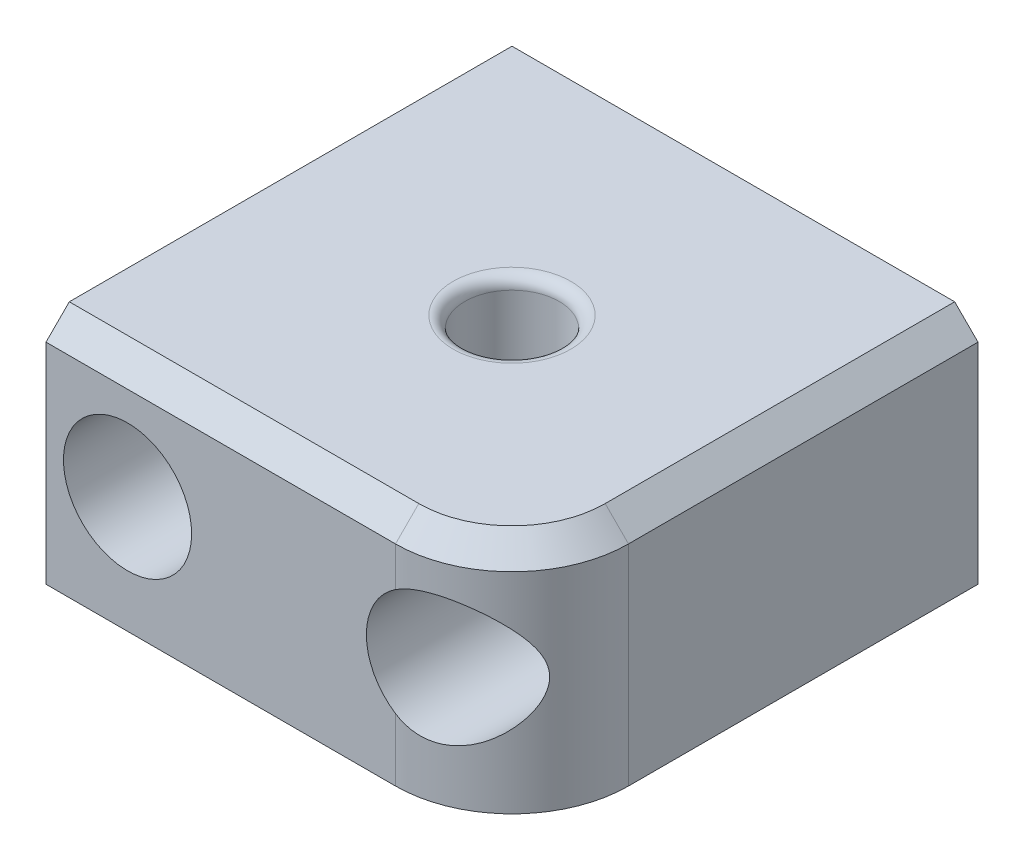
ISO-10303-21;
HEADER;
FILE_DESCRIPTION(('STEP AP214'),'2;1');
FILE_NAME('part.step','',(''),(''),'','','');
FILE_SCHEMA(('AUTOMOTIVE_DESIGN { 1 0 10303 214 1 1 1 1 }'));
ENDSEC;
DATA;
#1=APPLICATION_CONTEXT('core data for automotive mechanical design processes');
#2=APPLICATION_PROTOCOL_DEFINITION('international standard','automotive_design',2000,#1);
#3=PRODUCT_CONTEXT('',#1,'mechanical');
#4=PRODUCT('Part','Part','',(#3));
#5=PRODUCT_RELATED_PRODUCT_CATEGORY('part','',(#4));
#6=PRODUCT_DEFINITION_FORMATION('','',#4);
#7=PRODUCT_DEFINITION_CONTEXT('part definition',#1,'design');
#8=PRODUCT_DEFINITION('design','',#6,#7);
#9=PRODUCT_DEFINITION_SHAPE('','',#8);
#10=(LENGTH_UNIT() NAMED_UNIT(*) SI_UNIT(.MILLI.,.METRE.));
#11=(NAMED_UNIT(*) PLANE_ANGLE_UNIT() SI_UNIT($,.RADIAN.));
#12=(NAMED_UNIT(*) SI_UNIT($,.STERADIAN.) SOLID_ANGLE_UNIT());
#13=UNCERTAINTY_MEASURE_WITH_UNIT(LENGTH_MEASURE(1.E-05),#10,'distance_accuracy_value','');
#14=(GEOMETRIC_REPRESENTATION_CONTEXT(3) GLOBAL_UNCERTAINTY_ASSIGNED_CONTEXT((#13)) GLOBAL_UNIT_ASSIGNED_CONTEXT((#10,
#11,#12)) REPRESENTATION_CONTEXT('',''));
#15=CARTESIAN_POINT('',(0.,0.,0.));
#16=DIRECTION('',(0.,0.,1.));
#17=DIRECTION('',(1.,0.,0.));
#18=AXIS2_PLACEMENT_3D('',#15,#16,#17);
#19=CARTESIAN_POINT('',(10.,20.,20.));
#20=DIRECTION('',(0.,0.,-1.));
#21=DIRECTION('',(-1.,0.,0.));
#22=AXIS2_PLACEMENT_3D('',#19,#20,#21);
#23=PLANE('',#22);
#24=CARTESIAN_POINT('',(-13.,10.,20.));
#25=DIRECTION('',(0.,0.,1.));
#26=DIRECTION('',(1.,0.,0.));
#27=AXIS2_PLACEMENT_3D('',#24,#25,#26);
#28=CIRCLE('',#27,5.5);
#29=CARTESIAN_POINT('',(-7.5,10.,20.));
#30=VERTEX_POINT('',#29);
#31=EDGE_CURVE('E122',#30,#30,#28,.T.);
#32=ORIENTED_EDGE('',*,*,#31,.F.);
#33=EDGE_LOOP('',(#32));
#34=FACE_BOUND('',#33,.T.);
#35=DIRECTION('',(0.,-1.,0.));
#36=VECTOR('',#35,1.);
#37=CARTESIAN_POINT('',(10.,20.,20.));
#38=LINE('',#37,#36);
#39=CARTESIAN_POINT('',(10.,18.,20.));
#40=VERTEX_POINT('',#39);
#41=CARTESIAN_POINT('',(10.,14.6097722286465,20.));
#42=VERTEX_POINT('',#41);
#43=EDGE_CURVE('E102',#40,#42,#38,.T.);
#44=ORIENTED_EDGE('',*,*,#43,.F.);
#45=DIRECTION('',(-1.,0.,0.));
#46=VECTOR('',#45,1.);
#47=CARTESIAN_POINT('',(-20.,18.,20.));
#48=LINE('',#47,#46);
#49=CARTESIAN_POINT('',(-20.,18.,20.));
#50=VERTEX_POINT('',#49);
#51=EDGE_CURVE('E57',#40,#50,#48,.T.);
#52=ORIENTED_EDGE('',*,*,#51,.T.);
#53=DIRECTION('',(0.,-1.,0.));
#54=VECTOR('',#53,1.);
#55=CARTESIAN_POINT('',(-20.,20.,20.));
#56=LINE('',#55,#54);
#57=CARTESIAN_POINT('',(-20.,0.,20.));
#58=VERTEX_POINT('',#57);
#59=EDGE_CURVE('E111',#50,#58,#56,.T.);
#60=ORIENTED_EDGE('',*,*,#59,.T.);
#61=DIRECTION('',(1.,0.,0.));
#62=VECTOR('',#61,1.);
#63=CARTESIAN_POINT('',(10.,0.,20.));
#64=LINE('',#63,#62);
#65=CARTESIAN_POINT('',(10.,0.,20.));
#66=VERTEX_POINT('',#65);
#67=EDGE_CURVE('E381',#58,#66,#64,.T.);
#68=ORIENTED_EDGE('',*,*,#67,.T.);
#69=CARTESIAN_POINT('',(10.,5.39022777135355,20.));
#70=VERTEX_POINT('',#69);
#71=EDGE_CURVE('E115',#70,#66,#38,.T.);
#72=ORIENTED_EDGE('',*,*,#71,.F.);
#73=CARTESIAN_POINT('',(13.,10.,20.));
#74=DIRECTION('',(0.,0.,1.));
#75=DIRECTION('',(1.,0.,0.));
#76=AXIS2_PLACEMENT_3D('',#73,#74,#75);
#77=CIRCLE('',#76,5.5);
#78=EDGE_CURVE('E116',#42,#70,#77,.T.);
#79=ORIENTED_EDGE('',*,*,#78,.F.);
#80=EDGE_LOOP('',(#44,#52,#60,#68,#72,#79));
#81=FACE_BOUND('',#80,.T.);
#82=ADVANCED_FACE('F41',(#34,#81),#23,.F.);
#83=CARTESIAN_POINT('',(13.,10.,-20.));
#84=DIRECTION('',(0.,0.,1.));
#85=DIRECTION('',(1.,0.,0.));
#86=AXIS2_PLACEMENT_3D('',#83,#84,#85);
#87=CYLINDRICAL_SURFACE('',#86,2.65);
#88=CARTESIAN_POINT('',(13.,10.,-20.));
#89=DIRECTION('',(0.,0.,-1.));
#90=DIRECTION('',(-1.,0.,0.));
#91=AXIS2_PLACEMENT_3D('',#88,#89,#90);
#92=CIRCLE('',#91,2.65);
#93=CARTESIAN_POINT('',(10.35,10.,-20.));
#94=VERTEX_POINT('',#93);
#95=EDGE_CURVE('E120',#94,#94,#92,.T.);
#96=ORIENTED_EDGE('',*,*,#95,.T.);
#97=EDGE_LOOP('',(#96));
#98=FACE_BOUND('',#97,.T.);
#99=CARTESIAN_POINT('',(13.,10.,-9.00000000000001));
#100=DIRECTION('',(0.,0.,1.));
#101=DIRECTION('',(1.,0.,0.));
#102=AXIS2_PLACEMENT_3D('',#99,#100,#101);
#103=CIRCLE('',#102,2.65);
#104=CARTESIAN_POINT('',(15.65,10.,-9.00000000000001));
#105=VERTEX_POINT('',#104);
#106=EDGE_CURVE('E117',#105,#105,#103,.T.);
#107=ORIENTED_EDGE('',*,*,#106,.T.);
#108=EDGE_LOOP('',(#107));
#109=FACE_BOUND('',#108,.T.);
#110=ADVANCED_FACE('F157',(#98,#109),#87,.F.);
#111=CARTESIAN_POINT('',(-13.,10.,-20.));
#112=DIRECTION('',(0.,0.,1.));
#113=DIRECTION('',(1.,0.,0.));
#114=AXIS2_PLACEMENT_3D('',#111,#112,#113);
#115=CYLINDRICAL_SURFACE('',#114,2.65);
#116=CARTESIAN_POINT('',(-13.,10.,-20.));
#117=DIRECTION('',(0.,0.,1.));
#118=DIRECTION('',(1.,0.,0.));
#119=AXIS2_PLACEMENT_3D('',#116,#117,#118);
#120=CIRCLE('',#119,2.65);
#121=CARTESIAN_POINT('',(-10.35,10.,-20.));
#122=VERTEX_POINT('',#121);
#123=EDGE_CURVE('E137',#122,#122,#120,.T.);
#124=ORIENTED_EDGE('',*,*,#123,.F.);
#125=EDGE_LOOP('',(#124));
#126=FACE_BOUND('',#125,.T.);
#127=CARTESIAN_POINT('',(-13.,10.,-9.00000000000001));
#128=DIRECTION('',(0.,0.,1.));
#129=DIRECTION('',(1.,0.,0.));
#130=AXIS2_PLACEMENT_3D('',#127,#128,#129);
#131=CIRCLE('',#130,2.65);
#132=CARTESIAN_POINT('',(-10.35,10.,-9.00000000000001));
#133=VERTEX_POINT('',#132);
#134=EDGE_CURVE('E261',#133,#133,#131,.F.);
#135=ORIENTED_EDGE('',*,*,#134,.F.);
#136=EDGE_LOOP('',(#135));
#137=FACE_BOUND('',#136,.T.);
#138=ADVANCED_FACE('F155',(#126,#137),#115,.F.);
#139=CARTESIAN_POINT('',(10.,20.,10.));
#140=DIRECTION('',(0.,-1.,0.));
#141=DIRECTION('',(0.,0.,-1.));
#142=AXIS2_PLACEMENT_3D('',#139,#140,#141);
#143=CYLINDRICAL_SURFACE('',#142,10.);
#144=DIRECTION('',(0.,-1.,0.));
#145=VECTOR('',#144,1.);
#146=CARTESIAN_POINT('',(20.,20.,10.));
#147=LINE('',#146,#145);
#148=CARTESIAN_POINT('',(20.,18.,10.));
#149=VERTEX_POINT('',#148);
#150=CARTESIAN_POINT('',(20.,0.,10.));
#151=VERTEX_POINT('',#150);
#152=EDGE_CURVE('E248',#149,#151,#147,.T.);
#153=ORIENTED_EDGE('',*,*,#152,.F.);
#154=CARTESIAN_POINT('',(10.,18.,10.));
#155=DIRECTION('',(0.,1.,0.));
#156=DIRECTION('',(0.,0.,1.));
#157=AXIS2_PLACEMENT_3D('',#154,#155,#156);
#158=CIRCLE('',#157,10.);
#159=EDGE_CURVE('E63',#149,#40,#158,.F.);
#160=ORIENTED_EDGE('',*,*,#159,.T.);
#161=ORIENTED_EDGE('',*,*,#43,.T.);
#162=CARTESIAN_POINT('',(10.,14.6097722286465,20.));
#163=CARTESIAN_POINT('',(10.1173388692386,14.6861607876696,20.0000158263754));
#164=CARTESIAN_POINT('',(10.2376294395082,14.758041465536,19.9979354379046));
#165=CARTESIAN_POINT('',(10.4832188074938,14.8923759736413,19.9890697856227));
#166=CARTESIAN_POINT('',(10.6085183600978,14.9548283761489,19.9822838101093));
#167=CARTESIAN_POINT('',(10.8629399010457,15.0697568889503,19.9635130046729));
#168=CARTESIAN_POINT('',(10.9920537471823,15.12225269333,19.9515385949342));
#169=CARTESIAN_POINT('',(11.2533138802797,15.2171252254948,19.9220198237589));
#170=CARTESIAN_POINT('',(11.3854598730991,15.2595029303022,19.9044760004965));
#171=CARTESIAN_POINT('',(11.6519200979873,15.3340272936006,19.8635366195592));
#172=CARTESIAN_POINT('',(11.7862371080745,15.3661595369929,19.8401328990352));
#173=CARTESIAN_POINT('',(12.0558214821592,15.4200950898568,19.7873627586316));
#174=CARTESIAN_POINT('',(12.1910891814806,15.4418945478979,19.7579941212132));
#175=CARTESIAN_POINT('',(12.4613663313027,15.4752536082437,19.6933466477788));
#176=CARTESIAN_POINT('',(12.5963758970356,15.4868204797413,19.6580720285713));
#177=CARTESIAN_POINT('',(12.8652866093096,15.4999985662062,19.5817367717533));
#178=CARTESIAN_POINT('',(12.9991873112607,15.5016059643148,19.5406739220322));
#179=CARTESIAN_POINT('',(13.2651050819672,15.4952185569551,19.452973458731));
#180=CARTESIAN_POINT('',(13.3971195111951,15.4872114188044,19.4063287543955));
#181=CARTESIAN_POINT('',(13.6583289179098,15.46203643792,19.3078543025935));
#182=CARTESIAN_POINT('',(13.7875228738198,15.4448653314676,19.256022713181));
#183=CARTESIAN_POINT('',(14.169888617195,15.3803441800482,19.0933257343682));
#184=CARTESIAN_POINT('',(14.4179132625106,15.3199841698074,18.9752352319712));
#185=CARTESIAN_POINT('',(14.9252484408264,15.1597220981765,18.7082729198162));
#186=CARTESIAN_POINT('',(15.1822298738246,15.0558870730931,18.557402885908));
#187=CARTESIAN_POINT('',(15.6710840861988,14.8155537367402,18.2415725618588));
#188=CARTESIAN_POINT('',(15.9029429915791,14.6790375093799,18.0766045751189));
#189=CARTESIAN_POINT('',(16.2534603968918,14.4374181596721,17.8052642955046));
#190=CARTESIAN_POINT('',(16.380571008897,14.3413008640576,17.7015741573647));
#191=CARTESIAN_POINT('',(16.6250834004998,14.1393126927105,17.4922717479223));
#192=CARTESIAN_POINT('',(16.7424865665872,14.0334432144396,17.3866597537515));
#193=CARTESIAN_POINT('',(16.9676082309509,13.8122204451634,17.1747035302275));
#194=CARTESIAN_POINT('',(17.0753160254007,13.6968569350908,17.0683586278089));
#195=CARTESIAN_POINT('',(17.2807712486375,13.4568697490415,16.8565384344219));
#196=CARTESIAN_POINT('',(17.3785206990659,13.3322479615047,16.7510629709608));
#197=CARTESIAN_POINT('',(17.5461808054492,13.0981970876933,16.5626136636907));
#198=CARTESIAN_POINT('',(17.6178481631539,12.9903937251048,16.4791795561284));
#199=CARTESIAN_POINT('',(17.7542928543877,12.7683364082798,16.3152442502903));
#200=CARTESIAN_POINT('',(17.8190694159156,12.6540817334695,16.2347433812988));
#201=CARTESIAN_POINT('',(17.9412658665028,12.4189701308323,16.0783322634051));
#202=CARTESIAN_POINT('',(17.9986972602661,12.2981239615356,16.0024149362953));
#203=CARTESIAN_POINT('',(18.1057355521932,12.0493393849904,15.8570641331475));
#204=CARTESIAN_POINT('',(18.1553463807849,11.9214045842926,15.7876274073198));
#205=CARTESIAN_POINT('',(18.2587045302167,11.6210626287362,15.6395073082079));
#206=CARTESIAN_POINT('',(18.3097135011064,11.446241443709,15.5636875863487));
#207=CARTESIAN_POINT('',(18.3951234486174,11.0848584294389,15.4339677159678));
#208=CARTESIAN_POINT('',(18.4295594624046,10.8983223198448,15.3800213629877));
#209=CARTESIAN_POINT('',(18.4754104216249,10.5447489842485,15.307449184269));
#210=CARTESIAN_POINT('',(18.4894787886144,10.3789134533801,15.2847766715132));
#211=CARTESIAN_POINT('',(18.5023444652193,10.045140341422,15.2640594001967));
#212=CARTESIAN_POINT('',(18.5011513073911,9.87720413793042,15.2659992684014));
#213=CARTESIAN_POINT('',(18.4836459191987,9.54466970912424,15.29414577743));
#214=CARTESIAN_POINT('',(18.4673687615747,9.3800646452801,15.3202961248387));
#215=CARTESIAN_POINT('',(18.4211022628984,9.05750168172021,15.393225537063));
#216=CARTESIAN_POINT('',(18.3910948396507,8.8995528484958,15.4400318019761));
#217=CARTESIAN_POINT('',(18.2979898239858,8.50196966721451,15.581573275045));
#218=CARTESIAN_POINT('',(18.2258069014167,8.26875998559546,15.6883181746135));
#219=CARTESIAN_POINT('',(18.0992521773763,7.9355763260172,15.8657924414168));
#220=CARTESIAN_POINT('',(18.0539048876099,7.82707471166532,15.9279937452781));
#221=CARTESIAN_POINT('',(17.9575026808773,7.61532520585413,16.0567810834184));
#222=CARTESIAN_POINT('',(17.9064491765756,7.51207602324151,16.1233660307863));
#223=CARTESIAN_POINT('',(17.7672529242272,7.25112508860536,16.2999051427084));
#224=CARTESIAN_POINT('',(17.6750014809067,7.09724386105892,16.412265529435));
#225=CARTESIAN_POINT('',(17.4777040197303,6.8012823795196,16.6412978197819));
#226=CARTESIAN_POINT('',(17.3726511507165,6.65920851369153,16.7579720086205));
#227=CARTESIAN_POINT('',(17.150083310473,6.38644052350263,16.9930346380498));
#228=CARTESIAN_POINT('',(17.0325579351948,6.25575606783647,17.1114244375234));
#229=CARTESIAN_POINT('',(16.7853422935502,6.00599891033365,17.3476776531527));
#230=CARTESIAN_POINT('',(16.6556544072294,5.88692394593357,17.4655411675861));
#231=CARTESIAN_POINT('',(16.3810027457244,5.65816781602905,17.7017126442083));
#232=CARTESIAN_POINT('',(16.2357505287406,5.54877492961582,17.8199653595798));
#233=CARTESIAN_POINT('',(15.9327425781965,5.34355287667126,18.0522674861234));
#234=CARTESIAN_POINT('',(15.7749848644439,5.247725864958,18.1663162274085));
#235=CARTESIAN_POINT('',(15.4476861289906,5.07117358478961,18.3881893812908));
#236=CARTESIAN_POINT('',(15.2781715986556,4.99041578633516,18.4960268457261));
#237=CARTESIAN_POINT('',(14.9277375788884,4.84541538268462,18.7039562329069));
#238=CARTESIAN_POINT('',(14.7468235208477,4.78116498540428,18.8040517944537));
#239=CARTESIAN_POINT('',(14.4296043627291,4.68728371737229,18.9666248380371));
#240=CARTESIAN_POINT('',(14.295874635604,4.65303100034863,19.0314919524443));
#241=CARTESIAN_POINT('',(14.0238776391738,4.59435306727914,19.1559136375513));
#242=CARTESIAN_POINT('',(13.8856115147384,4.56992539196902,19.2154695347708));
#243=CARTESIAN_POINT('',(13.6053620431143,4.53158857270311,19.3286755026767));
#244=CARTESIAN_POINT('',(13.4633814726475,4.51767179141337,19.3823298372385));
#245=CARTESIAN_POINT('',(13.176520711705,4.50095647302362,19.4832923094626));
#246=CARTESIAN_POINT('',(13.0316404721737,4.49815812418202,19.5306003396556));
#247=CARTESIAN_POINT('',(12.7392597328832,4.50422786590803,19.6187263197768));
#248=CARTESIAN_POINT('',(12.5917490933791,4.51316149057105,19.659506373092));
#249=CARTESIAN_POINT('',(12.2961691208234,4.54319770291698,19.7340042820599));
#250=CARTESIAN_POINT('',(12.1480997591842,4.56430092189311,19.7677217712211));
#251=CARTESIAN_POINT('',(11.8527553083062,4.61888718474812,19.8280216116376));
#252=CARTESIAN_POINT('',(11.7054803440871,4.65237212268595,19.8546028701736));
#253=CARTESIAN_POINT('',(11.4132421880147,4.7316851428249,19.9007399452591));
#254=CARTESIAN_POINT('',(11.2682784033673,4.77751000420343,19.9202975919255));
#255=CARTESIAN_POINT('',(10.9283526112748,4.90078555373354,19.9587784679679));
#256=CARTESIAN_POINT('',(10.7349693221037,4.98365445290103,19.9747284927647));
#257=CARTESIAN_POINT('',(10.4528875930995,5.12421451230605,19.9901852628815));
#258=CARTESIAN_POINT('',(10.3602321929138,5.17375154184167,19.9939263587969));
#259=CARTESIAN_POINT('',(10.1778443235659,5.27808675774958,19.9988341724793));
#260=CARTESIAN_POINT('',(10.0881122498723,5.33288565202323,20.0000005433496));
#261=CARTESIAN_POINT('',(10.,5.39022777135355,20.));
#262=B_SPLINE_CURVE_WITH_KNOTS('',3,(#162,#163,#164,#165,#166,#167,#168,#169,#170,#171,#172,
#173,#174,#175,#176,#177,#178,#179,#180,#181,#182,#183,#184,#185,#186,#187,#188,#189,#190,#191,
#192,#193,#194,#195,#196,#197,#198,#199,#200,#201,#202,#203,#204,#205,#206,#207,#208,#209,#210,
#211,#212,#213,#214,#215,#216,#217,#218,#219,#220,#221,#222,#223,#224,#225,#226,#227,#228,#229,
#230,#231,#232,#233,#234,#235,#236,#237,#238,#239,#240,#241,#242,#243,#244,#245,#246,#247,#248,
#249,#250,#251,#252,#253,#254,#255,#256,#257,#258,#259,#260,#261),.UNSPECIFIED.,.F.,.F.,(4,2,2,
2,2,2,2,2,2,2,2,2,2,2,2,2,2,2,2,2,2,2,2,2,2,2,2,2,2,2,2,2,2,2,2,2,2,2,2,2,2,2,2,2,2,2,2,2,2,4),
(0.,0.419942565737726,0.839948660063895,1.25911511740366,1.67824108287348,2.0979541718961,
2.51782358150687,2.93739447730783,3.3571261591041,3.77739681146972,4.19781724190184,
5.03844222722302,5.98186862617326,6.9258134080197,7.4957409457197,8.06558694099801,
8.63605452998839,9.20640607672379,9.66815199407667,10.1299495881568,10.5910147738264,
11.0518474953463,11.6418512526907,12.2306021333771,12.7321908071276,13.233466197066,
13.7335789572169,14.2343522494472,15.0288369371579,15.4277740894608,15.8266126963587,
16.4608045496602,17.0953373173474,17.7304036094526,18.3653458856093,19.0152840234837,
19.665325282671,20.3139466360101,20.9622612519876,21.4194173256134,21.8764588991333,
22.3331680607584,22.7898849553966,23.2491639264142,23.7084667245023,24.1678398122418,
24.6270931158079,25.2581157938651,25.5733453839875,25.8886174428845),.UNSPECIFIED.);
#263=EDGE_CURVE('E108',#42,#70,#262,.T.);
#264=ORIENTED_EDGE('',*,*,#263,.T.);
#265=ORIENTED_EDGE('',*,*,#71,.T.);
#266=CARTESIAN_POINT('',(10.,0.,10.));
#267=DIRECTION('',(0.,1.,0.));
#268=DIRECTION('',(0.,0.,1.));
#269=AXIS2_PLACEMENT_3D('',#266,#267,#268);
#270=CIRCLE('',#269,10.);
#271=EDGE_CURVE('E254',#66,#151,#270,.T.);
#272=ORIENTED_EDGE('',*,*,#271,.T.);
#273=EDGE_LOOP('',(#153,#160,#161,#264,#265,#272));
#274=FACE_BOUND('',#273,.T.);
#275=ADVANCED_FACE('F110',(#274),#143,.T.);
#276=CARTESIAN_POINT('',(20.,20.,-20.));
#277=DIRECTION('',(0.,0.,1.));
#278=DIRECTION('',(1.,0.,0.));
#279=AXIS2_PLACEMENT_3D('',#276,#277,#278);
#280=PLANE('',#279);
#281=DIRECTION('',(-1.,0.,0.));
#282=VECTOR('',#281,1.);
#283=CARTESIAN_POINT('',(20.,20.,-20.));
#284=LINE('',#283,#282);
#285=CARTESIAN_POINT('',(18.,20.,-20.));
#286=VERTEX_POINT('',#285);
#287=CARTESIAN_POINT('',(-20.,20.,-20.));
#288=VERTEX_POINT('',#287);
#289=EDGE_CURVE('E387',#286,#288,#284,.T.);
#290=ORIENTED_EDGE('',*,*,#289,.F.);
#291=DIRECTION('',(0.707106781186546,-0.707106781186549,0.));
#292=VECTOR('',#291,1.);
#293=CARTESIAN_POINT('',(18.,20.,-20.));
#294=LINE('',#293,#292);
#295=CARTESIAN_POINT('',(20.,18.,-20.));
#296=VERTEX_POINT('',#295);
#297=EDGE_CURVE('E239',#286,#296,#294,.T.);
#298=ORIENTED_EDGE('',*,*,#297,.T.);
#299=DIRECTION('',(0.,-1.,0.));
#300=VECTOR('',#299,1.);
#301=CARTESIAN_POINT('',(20.,20.,-20.));
#302=LINE('',#301,#300);
#303=CARTESIAN_POINT('',(20.,0.,-20.));
#304=VERTEX_POINT('',#303);
#305=EDGE_CURVE('E252',#296,#304,#302,.T.);
#306=ORIENTED_EDGE('',*,*,#305,.T.);
#307=DIRECTION('',(-1.,0.,0.));
#308=VECTOR('',#307,1.);
#309=CARTESIAN_POINT('',(20.,0.,-20.));
#310=LINE('',#309,#308);
#311=CARTESIAN_POINT('',(-20.,0.,-20.));
#312=VERTEX_POINT('',#311);
#313=EDGE_CURVE('E391',#304,#312,#310,.T.);
#314=ORIENTED_EDGE('',*,*,#313,.T.);
#315=DIRECTION('',(0.,-1.,0.));
#316=VECTOR('',#315,1.);
#317=CARTESIAN_POINT('',(-20.,20.,-20.));
#318=LINE('',#317,#316);
#319=EDGE_CURVE('E259',#288,#312,#318,.T.);
#320=ORIENTED_EDGE('',*,*,#319,.F.);
#321=EDGE_LOOP('',(#290,#298,#306,#314,#320));
#322=FACE_BOUND('',#321,.T.);
#323=ORIENTED_EDGE('',*,*,#95,.F.);
#324=EDGE_LOOP('',(#323));
#325=FACE_BOUND('',#324,.T.);
#326=ORIENTED_EDGE('',*,*,#123,.T.);
#327=EDGE_LOOP('',(#326));
#328=FACE_BOUND('',#327,.T.);
#329=ADVANCED_FACE('F173',(#322,#325,#328),#280,.F.);
#330=CARTESIAN_POINT('',(10.,20.,10.));
#331=DIRECTION('',(0.,1.,0.));
#332=DIRECTION('',(0.,0.,1.));
#333=AXIS2_PLACEMENT_3D('',#330,#331,#332);
#334=PLANE('',#333);
#335=CARTESIAN_POINT('',(0.,20.,0.));
#336=DIRECTION('',(0.,1.,0.));
#337=DIRECTION('',(0.,0.,1.));
#338=AXIS2_PLACEMENT_3D('',#335,#336,#337);
#339=CIRCLE('',#338,5.05);
#340=CARTESIAN_POINT('',(0.,20.,5.05));
#341=VERTEX_POINT('',#340);
#342=EDGE_CURVE('E11',#341,#341,#339,.F.);
#343=ORIENTED_EDGE('',*,*,#342,.T.);
#344=EDGE_LOOP('',(#343));
#345=FACE_BOUND('',#344,.T.);
#346=CARTESIAN_POINT('',(10.,20.,10.));
#347=DIRECTION('',(0.,1.,0.));
#348=DIRECTION('',(0.,0.,1.));
#349=AXIS2_PLACEMENT_3D('',#346,#347,#348);
#350=CIRCLE('',#349,8.00000000000001);
#351=CARTESIAN_POINT('',(10.,20.,18.));
#352=VERTEX_POINT('',#351);
#353=CARTESIAN_POINT('',(18.,20.,10.));
#354=VERTEX_POINT('',#353);
#355=EDGE_CURVE('E234',#352,#354,#350,.T.);
#356=ORIENTED_EDGE('',*,*,#355,.T.);
#357=DIRECTION('',(0.,0.,-1.));
#358=VECTOR('',#357,1.);
#359=CARTESIAN_POINT('',(18.,20.,-20.));
#360=LINE('',#359,#358);
#361=EDGE_CURVE('E238',#354,#286,#360,.T.);
#362=ORIENTED_EDGE('',*,*,#361,.T.);
#363=ORIENTED_EDGE('',*,*,#289,.T.);
#364=DIRECTION('',(0.,0.,1.));
#365=VECTOR('',#364,1.);
#366=CARTESIAN_POINT('',(-20.,20.,20.));
#367=LINE('',#366,#365);
#368=CARTESIAN_POINT('',(-20.,20.,18.));
#369=VERTEX_POINT('',#368);
#370=EDGE_CURVE('E390',#288,#369,#367,.T.);
#371=ORIENTED_EDGE('',*,*,#370,.T.);
#372=DIRECTION('',(1.,0.,0.));
#373=VECTOR('',#372,1.);
#374=CARTESIAN_POINT('',(10.,20.,18.));
#375=LINE('',#374,#373);
#376=EDGE_CURVE('E223',#369,#352,#375,.T.);
#377=ORIENTED_EDGE('',*,*,#376,.T.);
#378=EDGE_LOOP('',(#356,#362,#363,#371,#377));
#379=FACE_BOUND('',#378,.T.);
#380=ADVANCED_FACE('F169',(#345,#379),#334,.T.);
#381=CARTESIAN_POINT('',(10.,0.,10.));
#382=DIRECTION('',(0.,1.,0.));
#383=DIRECTION('',(0.,0.,1.));
#384=AXIS2_PLACEMENT_3D('',#381,#382,#383);
#385=PLANE('',#384);
#386=DIRECTION('',(0.,0.,1.));
#387=VECTOR('',#386,1.);
#388=CARTESIAN_POINT('',(-20.,0.,20.));
#389=LINE('',#388,#387);
#390=EDGE_CURVE('E382',#312,#58,#389,.T.);
#391=ORIENTED_EDGE('',*,*,#390,.F.);
#392=ORIENTED_EDGE('',*,*,#313,.F.);
#393=DIRECTION('',(0.,0.,-1.));
#394=VECTOR('',#393,1.);
#395=CARTESIAN_POINT('',(20.,0.,10.));
#396=LINE('',#395,#394);
#397=EDGE_CURVE('E395',#151,#304,#396,.T.);
#398=ORIENTED_EDGE('',*,*,#397,.F.);
#399=ORIENTED_EDGE('',*,*,#271,.F.);
#400=ORIENTED_EDGE('',*,*,#67,.F.);
#401=EDGE_LOOP('',(#391,#392,#398,#399,#400));
#402=FACE_BOUND('',#401,.T.);
#403=CARTESIAN_POINT('',(0.,0.,0.));
#404=DIRECTION('',(0.,1.,0.));
#405=DIRECTION('',(0.,0.,1.));
#406=AXIS2_PLACEMENT_3D('',#403,#404,#405);
#407=CIRCLE('',#406,4.05);
#408=CARTESIAN_POINT('',(0.,0.,4.05));
#409=VERTEX_POINT('',#408);
#410=EDGE_CURVE('E378',#409,#409,#407,.T.);
#411=ORIENTED_EDGE('',*,*,#410,.T.);
#412=EDGE_LOOP('',(#411));
#413=FACE_BOUND('',#412,.T.);
#414=ADVANCED_FACE('F175',(#402,#413),#385,.F.);
#415=CARTESIAN_POINT('',(-20.,20.,20.));
#416=DIRECTION('',(1.,0.,0.));
#417=DIRECTION('',(0.,0.,-1.));
#418=AXIS2_PLACEMENT_3D('',#415,#416,#417);
#419=PLANE('',#418);
#420=ORIENTED_EDGE('',*,*,#59,.F.);
#421=DIRECTION('',(0.,0.707106781186549,-0.707106781186546));
#422=VECTOR('',#421,1.);
#423=CARTESIAN_POINT('',(-20.,20.,18.));
#424=LINE('',#423,#422);
#425=EDGE_CURVE('E219',#50,#369,#424,.T.);
#426=ORIENTED_EDGE('',*,*,#425,.T.);
#427=ORIENTED_EDGE('',*,*,#370,.F.);
#428=ORIENTED_EDGE('',*,*,#319,.T.);
#429=ORIENTED_EDGE('',*,*,#390,.T.);
#430=EDGE_LOOP('',(#420,#426,#427,#428,#429));
#431=FACE_BOUND('',#430,.T.);
#432=ADVANCED_FACE('F180',(#431),#419,.F.);
#433=CARTESIAN_POINT('',(20.,20.,10.));
#434=DIRECTION('',(-1.,0.,0.));
#435=DIRECTION('',(0.,0.,1.));
#436=AXIS2_PLACEMENT_3D('',#433,#434,#435);
#437=PLANE('',#436);
#438=ORIENTED_EDGE('',*,*,#305,.F.);
#439=DIRECTION('',(0.,0.,1.));
#440=VECTOR('',#439,1.);
#441=CARTESIAN_POINT('',(20.,18.,10.));
#442=LINE('',#441,#440);
#443=EDGE_CURVE('E246',#296,#149,#442,.T.);
#444=ORIENTED_EDGE('',*,*,#443,.T.);
#445=ORIENTED_EDGE('',*,*,#152,.T.);
#446=ORIENTED_EDGE('',*,*,#397,.T.);
#447=EDGE_LOOP('',(#438,#444,#445,#446));
#448=FACE_BOUND('',#447,.T.);
#449=ADVANCED_FACE('F170',(#448),#437,.F.);
#450=CARTESIAN_POINT('',(0.,20.,0.));
#451=DIRECTION('',(0.,-1.,0.));
#452=DIRECTION('',(0.,0.,-1.));
#453=AXIS2_PLACEMENT_3D('',#450,#451,#452);
#454=CYLINDRICAL_SURFACE('',#453,4.05);
#455=CARTESIAN_POINT('',(0.,19.,0.));
#456=DIRECTION('',(0.,1.,0.));
#457=DIRECTION('',(0.,0.,1.));
#458=AXIS2_PLACEMENT_3D('',#455,#456,#457);
#459=CIRCLE('',#458,4.05);
#460=CARTESIAN_POINT('',(0.,19.,4.05));
#461=VERTEX_POINT('',#460);
#462=EDGE_CURVE('E47',#461,#461,#459,.T.);
#463=ORIENTED_EDGE('',*,*,#462,.T.);
#464=EDGE_LOOP('',(#463));
#465=FACE_BOUND('',#464,.T.);
#466=ORIENTED_EDGE('',*,*,#410,.F.);
#467=EDGE_LOOP('',(#466));
#468=FACE_BOUND('',#467,.T.);
#469=ADVANCED_FACE('F161',(#465,#468),#454,.F.);
#470=CARTESIAN_POINT('',(-13.,10.,-9.00000000000001));
#471=DIRECTION('',(0.,0.,1.));
#472=DIRECTION('',(1.,0.,0.));
#473=AXIS2_PLACEMENT_3D('',#470,#471,#472);
#474=PLANE('',#473);
#475=CARTESIAN_POINT('',(-13.,10.,-9.00000000000001));
#476=DIRECTION('',(0.,0.,1.));
#477=DIRECTION('',(1.,0.,0.));
#478=AXIS2_PLACEMENT_3D('',#475,#476,#477);
#479=CIRCLE('',#478,5.5);
#480=CARTESIAN_POINT('',(-7.5,10.,-9.00000000000001));
#481=VERTEX_POINT('',#480);
#482=EDGE_CURVE('E123',#481,#481,#479,.T.);
#483=ORIENTED_EDGE('',*,*,#482,.T.);
#484=EDGE_LOOP('',(#483));
#485=FACE_BOUND('',#484,.T.);
#486=ORIENTED_EDGE('',*,*,#134,.T.);
#487=EDGE_LOOP('',(#486));
#488=FACE_BOUND('',#487,.T.);
#489=ADVANCED_FACE('F168',(#485,#488),#474,.T.);
#490=CARTESIAN_POINT('',(-13.,10.,-9.00000000000001));
#491=DIRECTION('',(0.,0.,1.));
#492=DIRECTION('',(1.,0.,0.));
#493=AXIS2_PLACEMENT_3D('',#490,#491,#492);
#494=CYLINDRICAL_SURFACE('',#493,5.5);
#495=CARTESIAN_POINT('',(-7.5,10.,-9.00000000000001));
#496=CARTESIAN_POINT('',(-7.5,10.,-8.69791666666667));
#497=CARTESIAN_POINT('',(-7.5,10.,-8.39583333333334));
#498=CARTESIAN_POINT('',(-7.5,10.,-7.79166666666667));
#499=CARTESIAN_POINT('',(-7.5,10.,-7.48958333333334));
#500=CARTESIAN_POINT('',(-7.5,10.,-6.88541666666667));
#501=CARTESIAN_POINT('',(-7.5,10.,-6.58333333333334));
#502=CARTESIAN_POINT('',(-7.5,10.,-5.97916666666667));
#503=CARTESIAN_POINT('',(-7.5,10.,-5.67708333333334));
#504=CARTESIAN_POINT('',(-7.5,10.,-5.07291666666667));
#505=CARTESIAN_POINT('',(-7.5,10.,-4.77083333333334));
#506=CARTESIAN_POINT('',(-7.5,10.,-4.16666666666667));
#507=CARTESIAN_POINT('',(-7.5,10.,-3.86458333333334));
#508=CARTESIAN_POINT('',(-7.5,10.,-3.26041666666667));
#509=CARTESIAN_POINT('',(-7.5,10.,-2.95833333333334));
#510=CARTESIAN_POINT('',(-7.5,10.,-2.35416666666667));
#511=CARTESIAN_POINT('',(-7.5,10.,-2.05208333333334));
#512=CARTESIAN_POINT('',(-7.5,10.,-1.44791666666667));
#513=CARTESIAN_POINT('',(-7.5,10.,-1.14583333333334));
#514=CARTESIAN_POINT('',(-7.5,10.,-0.541666666666671));
#515=CARTESIAN_POINT('',(-7.5,10.,-0.239583333333338));
#516=CARTESIAN_POINT('',(-7.5,10.,0.364583333333328));
#517=CARTESIAN_POINT('',(-7.5,10.,0.666666666666662));
#518=CARTESIAN_POINT('',(-7.5,10.,1.27083333333333));
#519=CARTESIAN_POINT('',(-7.5,10.,1.57291666666666));
#520=CARTESIAN_POINT('',(-7.5,10.,2.17708333333333));
#521=CARTESIAN_POINT('',(-7.5,10.,2.47916666666666));
#522=CARTESIAN_POINT('',(-7.5,10.,3.08333333333333));
#523=CARTESIAN_POINT('',(-7.5,10.,3.38541666666666));
#524=CARTESIAN_POINT('',(-7.5,10.,3.98958333333333));
#525=CARTESIAN_POINT('',(-7.5,10.,4.29166666666666));
#526=CARTESIAN_POINT('',(-7.5,10.,4.89583333333333));
#527=CARTESIAN_POINT('',(-7.5,10.,5.19791666666666));
#528=CARTESIAN_POINT('',(-7.5,10.,5.80208333333333));
#529=CARTESIAN_POINT('',(-7.5,10.,6.10416666666666));
#530=CARTESIAN_POINT('',(-7.5,10.,6.70833333333333));
#531=CARTESIAN_POINT('',(-7.5,10.,7.01041666666666));
#532=CARTESIAN_POINT('',(-7.5,10.,7.61458333333333));
#533=CARTESIAN_POINT('',(-7.5,10.,7.91666666666666));
#534=CARTESIAN_POINT('',(-7.5,10.,8.52083333333333));
#535=CARTESIAN_POINT('',(-7.5,10.,8.82291666666666));
#536=CARTESIAN_POINT('',(-7.5,10.,9.42708333333333));
#537=CARTESIAN_POINT('',(-7.5,10.,9.72916666666666));
#538=CARTESIAN_POINT('',(-7.5,10.,10.3333333333333));
#539=CARTESIAN_POINT('',(-7.5,10.,10.6354166666667));
#540=CARTESIAN_POINT('',(-7.5,10.,11.2395833333333));
#541=CARTESIAN_POINT('',(-7.5,10.,11.5416666666667));
#542=CARTESIAN_POINT('',(-7.5,10.,12.1458333333333));
#543=CARTESIAN_POINT('',(-7.5,10.,12.4479166666667));
#544=CARTESIAN_POINT('',(-7.5,10.,13.0520833333333));
#545=CARTESIAN_POINT('',(-7.5,10.,13.3541666666667));
#546=CARTESIAN_POINT('',(-7.5,10.,13.9583333333333));
#547=CARTESIAN_POINT('',(-7.5,10.,14.2604166666667));
#548=CARTESIAN_POINT('',(-7.5,10.,14.8645833333333));
#549=CARTESIAN_POINT('',(-7.5,10.,15.1666666666667));
#550=CARTESIAN_POINT('',(-7.5,10.,15.7708333333333));
#551=CARTESIAN_POINT('',(-7.5,10.,16.0729166666667));
#552=CARTESIAN_POINT('',(-7.5,10.,16.6770833333333));
#553=CARTESIAN_POINT('',(-7.5,10.,16.9791666666667));
#554=CARTESIAN_POINT('',(-7.5,10.,17.5833333333333));
#555=CARTESIAN_POINT('',(-7.5,10.,17.8854166666667));
#556=CARTESIAN_POINT('',(-7.5,10.,18.4895833333333));
#557=CARTESIAN_POINT('',(-7.5,10.,18.7916666666667));
#558=CARTESIAN_POINT('',(-7.5,10.,19.3958333333333));
#559=CARTESIAN_POINT('',(-7.5,10.,19.6979166666667));
#560=CARTESIAN_POINT('',(-7.5,10.,20.));
#561=B_SPLINE_CURVE_WITH_KNOTS('',3,(#495,#496,#497,#498,#499,#500,#501,#502,#503,#504,#505,
#506,#507,#508,#509,#510,#511,#512,#513,#514,#515,#516,#517,#518,#519,#520,#521,#522,#523,#524,
#525,#526,#527,#528,#529,#530,#531,#532,#533,#534,#535,#536,#537,#538,#539,#540,#541,#542,#543,
#544,#545,#546,#547,#548,#549,#550,#551,#552,#553,#554,#555,#556,#557,#558,#559,#560),
.UNSPECIFIED.,.F.,.F.,(4,2,2,2,2,2,2,2,2,2,2,2,2,2,2,2,2,2,2,2,2,2,2,2,2,2,2,2,2,2,2,2,4),(0.,
0.906249999999999,1.8125,2.71875,3.625,4.53125,5.4375,6.34375,7.25,8.15625,9.0625,9.96875,
10.875,11.78125,12.6875,13.59375,14.5,15.40625,16.3125,17.21875,18.125,19.03125,19.9375,
20.84375,21.75,22.65625,23.5625,24.46875,25.375,26.28125,27.1875,28.09375,29.),.UNSPECIFIED.);
#562=EDGE_CURVE('BSEAM150',#481,#30,#561,.T.);
#563=ORIENTED_EDGE('',*,*,#482,.F.);
#564=ORIENTED_EDGE('',*,*,#31,.T.);
#565=ORIENTED_EDGE('',*,*,#562,.T.);
#566=ORIENTED_EDGE('',*,*,#562,.F.);
#567=EDGE_LOOP('',(#563,#565,#564,#566));
#568=FACE_BOUND('',#567,.T.);
#569=ADVANCED_FACE('F150',(#568),#494,.F.);
#570=CARTESIAN_POINT('',(13.,10.,-9.00000000000001));
#571=DIRECTION('',(0.,0.,1.));
#572=DIRECTION('',(1.,0.,0.));
#573=AXIS2_PLACEMENT_3D('',#570,#571,#572);
#574=CYLINDRICAL_SURFACE('',#573,5.5);
#575=CARTESIAN_POINT('',(13.,10.,-9.00000000000001));
#576=DIRECTION('',(0.,0.,1.));
#577=DIRECTION('',(1.,0.,0.));
#578=AXIS2_PLACEMENT_3D('',#575,#576,#577);
#579=CIRCLE('',#578,5.5);
#580=CARTESIAN_POINT('',(18.5,10.,-9.00000000000001));
#581=VERTEX_POINT('',#580);
#582=EDGE_CURVE('E125',#581,#581,#579,.T.);
#583=ORIENTED_EDGE('',*,*,#582,.F.);
#584=EDGE_LOOP('',(#583));
#585=FACE_BOUND('',#584,.T.);
#586=ORIENTED_EDGE('',*,*,#78,.T.);
#587=ORIENTED_EDGE('',*,*,#263,.F.);
#588=EDGE_LOOP('',(#586,#587));
#589=FACE_BOUND('',#588,.T.);
#590=ADVANCED_FACE('F114',(#585,#589),#574,.F.);
#591=CARTESIAN_POINT('',(13.,10.,-9.00000000000001));
#592=DIRECTION('',(0.,0.,1.));
#593=DIRECTION('',(1.,0.,0.));
#594=AXIS2_PLACEMENT_3D('',#591,#592,#593);
#595=PLANE('',#594);
#596=ORIENTED_EDGE('',*,*,#106,.F.);
#597=EDGE_LOOP('',(#596));
#598=FACE_BOUND('',#597,.T.);
#599=ORIENTED_EDGE('',*,*,#582,.T.);
#600=EDGE_LOOP('',(#599));
#601=FACE_BOUND('',#600,.T.);
#602=ADVANCED_FACE('F146',(#598,#601),#595,.T.);
#603=CARTESIAN_POINT('',(10.,20.,18.));
#604=DIRECTION('',(0.,0.707106781186546,0.707106781186549));
#605=DIRECTION('',(-1.,0.,0.));
#606=AXIS2_PLACEMENT_3D('',#603,#604,#605);
#607=PLANE('',#606);
#608=ORIENTED_EDGE('',*,*,#425,.F.);
#609=ORIENTED_EDGE('',*,*,#51,.F.);
#610=DIRECTION('',(0.,-0.707106781186549,0.707106781186546));
#611=VECTOR('',#610,1.);
#612=CARTESIAN_POINT('',(10.,20.,18.));
#613=LINE('',#612,#611);
#614=EDGE_CURVE('E130',#352,#40,#613,.T.);
#615=ORIENTED_EDGE('',*,*,#614,.F.);
#616=ORIENTED_EDGE('',*,*,#376,.F.);
#617=EDGE_LOOP('',(#608,#609,#615,#616));
#618=FACE_BOUND('',#617,.T.);
#619=ADVANCED_FACE('F154',(#618),#607,.T.);
#620=CARTESIAN_POINT('',(10.,20.,10.));
#621=DIRECTION('',(0.,-1.,0.));
#622=DIRECTION('',(0.,0.,-1.));
#623=AXIS2_PLACEMENT_3D('',#620,#621,#622);
#624=CONICAL_SURFACE('',#623,8.00000000000001,0.785398163397447);
#625=ORIENTED_EDGE('',*,*,#614,.T.);
#626=ORIENTED_EDGE('',*,*,#159,.F.);
#627=DIRECTION('',(0.707106781186546,-0.707106781186549,0.));
#628=VECTOR('',#627,1.);
#629=CARTESIAN_POINT('',(18.,20.,10.));
#630=LINE('',#629,#628);
#631=EDGE_CURVE('E230',#354,#149,#630,.T.);
#632=ORIENTED_EDGE('',*,*,#631,.F.);
#633=ORIENTED_EDGE('',*,*,#355,.F.);
#634=EDGE_LOOP('',(#625,#626,#632,#633));
#635=FACE_BOUND('',#634,.T.);
#636=ADVANCED_FACE('F205',(#635),#624,.T.);
#637=CARTESIAN_POINT('',(18.,20.,10.));
#638=DIRECTION('',(0.707106781186549,0.707106781186546,0.));
#639=DIRECTION('',(0.,0.,1.));
#640=AXIS2_PLACEMENT_3D('',#637,#638,#639);
#641=PLANE('',#640);
#642=ORIENTED_EDGE('',*,*,#631,.T.);
#643=ORIENTED_EDGE('',*,*,#443,.F.);
#644=ORIENTED_EDGE('',*,*,#297,.F.);
#645=ORIENTED_EDGE('',*,*,#361,.F.);
#646=EDGE_LOOP('',(#642,#643,#644,#645));
#647=FACE_BOUND('',#646,.T.);
#648=ADVANCED_FACE('F199',(#647),#641,.T.);
#649=CARTESIAN_POINT('',(0.,19.,0.));
#650=DIRECTION('',(0.,1.,0.));
#651=DIRECTION('',(0.,0.,1.));
#652=AXIS2_PLACEMENT_3D('',#649,#650,#651);
#653=TOROIDAL_SURFACE('',#652,5.05,1.);
#654=ORIENTED_EDGE('',*,*,#342,.F.);
#655=EDGE_LOOP('',(#654));
#656=FACE_BOUND('',#655,.T.);
#657=ORIENTED_EDGE('',*,*,#462,.F.);
#658=EDGE_LOOP('',(#657));
#659=FACE_BOUND('',#658,.T.);
#660=ADVANCED_FACE('F43',(#656,#659),#653,.T.);
#661=CLOSED_SHELL('',(#82,#110,#138,#275,#329,#380,#414,#432,#449,#469,#489,#569,#590,#602,#619,
#636,#648,#660));
#662=MANIFOLD_SOLID_BREP('B2',#661);
#663=ADVANCED_BREP_SHAPE_REPRESENTATION('',(#18,#662),#14);
#664=SHAPE_DEFINITION_REPRESENTATION(#9,#663);
ENDSEC;
END-ISO-10303-21;
